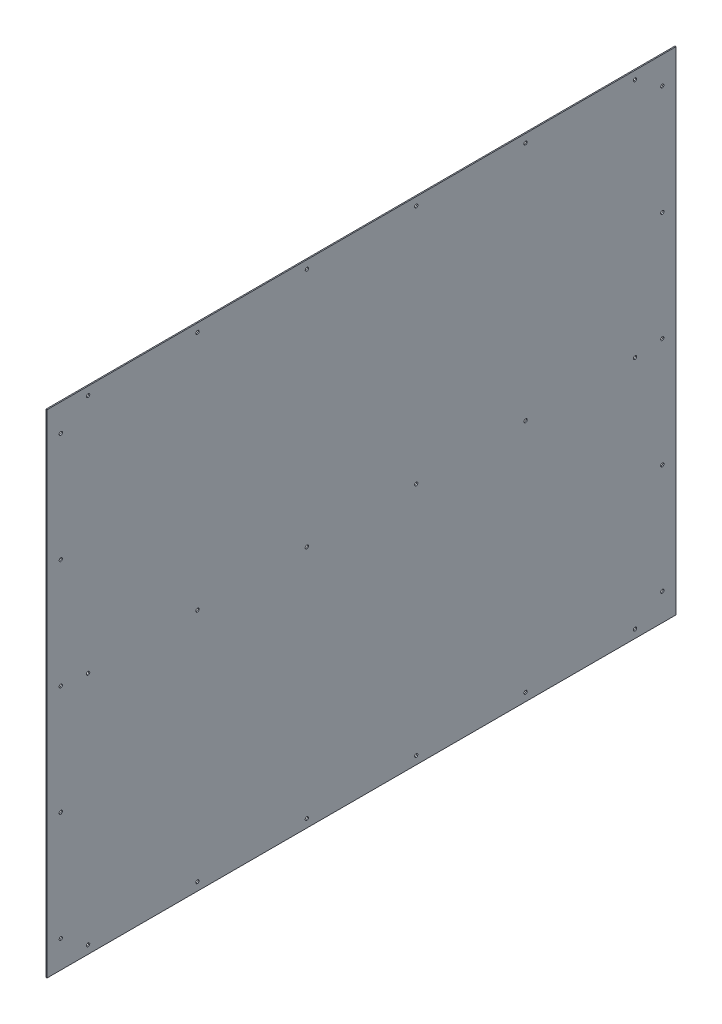
ISO-10303-21;
HEADER;
FILE_DESCRIPTION(('STEP AP214'),'2;1');
FILE_NAME('part.step','',(''),(''),'','','');
FILE_SCHEMA(('AUTOMOTIVE_DESIGN { 1 0 10303 214 1 1 1 1 }'));
ENDSEC;
DATA;
#1=APPLICATION_CONTEXT('core data for automotive mechanical design processes');
#2=APPLICATION_PROTOCOL_DEFINITION('international standard','automotive_design',2000,#1);
#3=PRODUCT_CONTEXT('',#1,'mechanical');
#4=PRODUCT('Part','Part','',(#3));
#5=PRODUCT_RELATED_PRODUCT_CATEGORY('part','',(#4));
#6=PRODUCT_DEFINITION_FORMATION('','',#4);
#7=PRODUCT_DEFINITION_CONTEXT('part definition',#1,'design');
#8=PRODUCT_DEFINITION('design','',#6,#7);
#9=PRODUCT_DEFINITION_SHAPE('','',#8);
#10=(LENGTH_UNIT() NAMED_UNIT(*) SI_UNIT(.MILLI.,.METRE.));
#11=(NAMED_UNIT(*) PLANE_ANGLE_UNIT() SI_UNIT($,.RADIAN.));
#12=(NAMED_UNIT(*) SI_UNIT($,.STERADIAN.) SOLID_ANGLE_UNIT());
#13=UNCERTAINTY_MEASURE_WITH_UNIT(LENGTH_MEASURE(1.E-05),#10,'distance_accuracy_value','');
#14=(GEOMETRIC_REPRESENTATION_CONTEXT(3) GLOBAL_UNCERTAINTY_ASSIGNED_CONTEXT((#13)) GLOBAL_UNIT_ASSIGNED_CONTEXT((#10,
#11,#12)) REPRESENTATION_CONTEXT('',''));
#15=CARTESIAN_POINT('',(0.,0.,0.));
#16=DIRECTION('',(0.,0.,1.));
#17=DIRECTION('',(1.,0.,0.));
#18=AXIS2_PLACEMENT_3D('',#15,#16,#17);
#19=CARTESIAN_POINT('',(2.,-450.,-575.));
#20=DIRECTION('',(0.,0.,1.));
#21=DIRECTION('',(1.,0.,0.));
#22=AXIS2_PLACEMENT_3D('',#19,#20,#21);
#23=PLANE('',#22);
#24=DIRECTION('',(0.,1.,0.));
#25=VECTOR('',#24,1.);
#26=CARTESIAN_POINT('',(0.,-450.,-575.));
#27=LINE('',#26,#25);
#28=CARTESIAN_POINT('',(0.,-450.,-575.));
#29=VERTEX_POINT('',#28);
#30=CARTESIAN_POINT('',(0.,450.,-575.));
#31=VERTEX_POINT('',#30);
#32=EDGE_CURVE('E110',#29,#31,#27,.T.);
#33=ORIENTED_EDGE('',*,*,#32,.T.);
#34=DIRECTION('',(-1.,0.,0.));
#35=VECTOR('',#34,1.);
#36=CARTESIAN_POINT('',(2.,450.,-575.));
#37=LINE('',#36,#35);
#38=CARTESIAN_POINT('',(2.,450.,-575.));
#39=VERTEX_POINT('',#38);
#40=EDGE_CURVE('E11',#39,#31,#37,.T.);
#41=ORIENTED_EDGE('',*,*,#40,.F.);
#42=DIRECTION('',(0.,1.,0.));
#43=VECTOR('',#42,1.);
#44=CARTESIAN_POINT('',(2.,-450.,-575.));
#45=LINE('',#44,#43);
#46=CARTESIAN_POINT('',(2.,-450.,-575.));
#47=VERTEX_POINT('',#46);
#48=EDGE_CURVE('E93',#47,#39,#45,.T.);
#49=ORIENTED_EDGE('',*,*,#48,.F.);
#50=DIRECTION('',(-1.,0.,0.));
#51=VECTOR('',#50,1.);
#52=CARTESIAN_POINT('',(2.,-450.,-575.));
#53=LINE('',#52,#51);
#54=EDGE_CURVE('E106',#47,#29,#53,.T.);
#55=ORIENTED_EDGE('',*,*,#54,.T.);
#56=EDGE_LOOP('',(#33,#41,#49,#55));
#57=FACE_BOUND('',#56,.T.);
#58=ADVANCED_FACE('F39',(#57),#23,.F.);
#59=CARTESIAN_POINT('',(2.,450.,575.));
#60=DIRECTION('',(0.,-1.,0.));
#61=DIRECTION('',(0.,0.,-1.));
#62=AXIS2_PLACEMENT_3D('',#59,#60,#61);
#63=PLANE('',#62);
#64=DIRECTION('',(0.,0.,1.));
#65=VECTOR('',#64,1.);
#66=CARTESIAN_POINT('',(0.,450.,575.));
#67=LINE('',#66,#65);
#68=CARTESIAN_POINT('',(0.,450.,575.));
#69=VERTEX_POINT('',#68);
#70=EDGE_CURVE('E98',#31,#69,#67,.T.);
#71=ORIENTED_EDGE('',*,*,#70,.T.);
#72=DIRECTION('',(-1.,0.,0.));
#73=VECTOR('',#72,1.);
#74=CARTESIAN_POINT('',(2.,450.,575.));
#75=LINE('',#74,#73);
#76=CARTESIAN_POINT('',(2.,450.,575.));
#77=VERTEX_POINT('',#76);
#78=EDGE_CURVE('E49',#77,#69,#75,.T.);
#79=ORIENTED_EDGE('',*,*,#78,.F.);
#80=DIRECTION('',(0.,0.,1.));
#81=VECTOR('',#80,1.);
#82=CARTESIAN_POINT('',(2.,450.,575.));
#83=LINE('',#82,#81);
#84=EDGE_CURVE('E88',#39,#77,#83,.T.);
#85=ORIENTED_EDGE('',*,*,#84,.F.);
#86=ORIENTED_EDGE('',*,*,#40,.T.);
#87=EDGE_LOOP('',(#71,#79,#85,#86));
#88=FACE_BOUND('',#87,.T.);
#89=ADVANCED_FACE('F97',(#88),#63,.F.);
#90=CARTESIAN_POINT('',(2.,-450.,575.));
#91=DIRECTION('',(0.,0.,-1.));
#92=DIRECTION('',(-1.,0.,0.));
#93=AXIS2_PLACEMENT_3D('',#90,#91,#92);
#94=PLANE('',#93);
#95=DIRECTION('',(0.,-1.,0.));
#96=VECTOR('',#95,1.);
#97=CARTESIAN_POINT('',(0.,-450.,575.));
#98=LINE('',#97,#96);
#99=CARTESIAN_POINT('',(0.,-450.,575.));
#100=VERTEX_POINT('',#99);
#101=EDGE_CURVE('E75',#69,#100,#98,.T.);
#102=ORIENTED_EDGE('',*,*,#101,.T.);
#103=DIRECTION('',(-1.,0.,0.));
#104=VECTOR('',#103,1.);
#105=CARTESIAN_POINT('',(2.,-450.,575.));
#106=LINE('',#105,#104);
#107=CARTESIAN_POINT('',(2.,-450.,575.));
#108=VERTEX_POINT('',#107);
#109=EDGE_CURVE('E100',#108,#100,#106,.T.);
#110=ORIENTED_EDGE('',*,*,#109,.F.);
#111=DIRECTION('',(0.,-1.,0.));
#112=VECTOR('',#111,1.);
#113=CARTESIAN_POINT('',(2.,-450.,575.));
#114=LINE('',#113,#112);
#115=EDGE_CURVE('E91',#77,#108,#114,.T.);
#116=ORIENTED_EDGE('',*,*,#115,.F.);
#117=ORIENTED_EDGE('',*,*,#78,.T.);
#118=EDGE_LOOP('',(#102,#110,#116,#117));
#119=FACE_BOUND('',#118,.T.);
#120=ADVANCED_FACE('F102',(#119),#94,.F.);
#121=CARTESIAN_POINT('',(2.,-450.,575.));
#122=DIRECTION('',(0.,1.,0.));
#123=DIRECTION('',(0.,0.,1.));
#124=AXIS2_PLACEMENT_3D('',#121,#122,#123);
#125=PLANE('',#124);
#126=DIRECTION('',(0.,0.,-1.));
#127=VECTOR('',#126,1.);
#128=CARTESIAN_POINT('',(0.,-450.,575.));
#129=LINE('',#128,#127);
#130=EDGE_CURVE('E81',#100,#29,#129,.T.);
#131=ORIENTED_EDGE('',*,*,#130,.T.);
#132=ORIENTED_EDGE('',*,*,#54,.F.);
#133=DIRECTION('',(0.,0.,-1.));
#134=VECTOR('',#133,1.);
#135=CARTESIAN_POINT('',(2.,-450.,575.));
#136=LINE('',#135,#134);
#137=EDGE_CURVE('E58',#108,#47,#136,.T.);
#138=ORIENTED_EDGE('',*,*,#137,.F.);
#139=ORIENTED_EDGE('',*,*,#109,.T.);
#140=EDGE_LOOP('',(#131,#132,#138,#139));
#141=FACE_BOUND('',#140,.T.);
#142=ADVANCED_FACE('F319',(#141),#125,.F.);
#143=CARTESIAN_POINT('',(2.,0.,0.));
#144=DIRECTION('',(-1.,0.,0.));
#145=DIRECTION('',(0.,0.,1.));
#146=AXIS2_PLACEMENT_3D('',#143,#144,#145);
#147=PLANE('',#146);
#148=CARTESIAN_POINT('',(2.,400.,-550.));
#149=DIRECTION('',(1.,0.,0.));
#150=DIRECTION('',(0.,0.,1.));
#151=AXIS2_PLACEMENT_3D('',#148,#149,#150);
#152=CIRCLE('',#151,3.00000000000005);
#153=CARTESIAN_POINT('',(2.,400.,-547.));
#154=VERTEX_POINT('',#153);
#155=EDGE_CURVE('E641',#154,#154,#152,.T.);
#156=ORIENTED_EDGE('',*,*,#155,.F.);
#157=EDGE_LOOP('',(#156));
#158=FACE_BOUND('',#157,.T.);
#159=CARTESIAN_POINT('',(2.,200.,-550.));
#160=DIRECTION('',(1.,0.,0.));
#161=DIRECTION('',(0.,0.,1.));
#162=AXIS2_PLACEMENT_3D('',#159,#160,#161);
#163=CIRCLE('',#162,3.00000000000005);
#164=CARTESIAN_POINT('',(2.,200.,-547.));
#165=VERTEX_POINT('',#164);
#166=EDGE_CURVE('E643',#165,#165,#163,.T.);
#167=ORIENTED_EDGE('',*,*,#166,.F.);
#168=EDGE_LOOP('',(#167));
#169=FACE_BOUND('',#168,.T.);
#170=CARTESIAN_POINT('',(2.,1.34711147906209E-13,-550.));
#171=DIRECTION('',(1.,0.,0.));
#172=DIRECTION('',(0.,0.,1.));
#173=AXIS2_PLACEMENT_3D('',#170,#171,#172);
#174=CIRCLE('',#173,3.00000000000005);
#175=CARTESIAN_POINT('',(2.,1.34711147906209E-13,-547.));
#176=VERTEX_POINT('',#175);
#177=EDGE_CURVE('E647',#176,#176,#174,.T.);
#178=ORIENTED_EDGE('',*,*,#177,.F.);
#179=EDGE_LOOP('',(#178));
#180=FACE_BOUND('',#179,.T.);
#181=CARTESIAN_POINT('',(2.,-200.,-550.));
#182=DIRECTION('',(1.,0.,0.));
#183=DIRECTION('',(0.,0.,1.));
#184=AXIS2_PLACEMENT_3D('',#181,#182,#183);
#185=CIRCLE('',#184,3.00000000000005);
#186=CARTESIAN_POINT('',(2.,-200.,-547.));
#187=VERTEX_POINT('',#186);
#188=EDGE_CURVE('E677',#187,#187,#185,.T.);
#189=ORIENTED_EDGE('',*,*,#188,.F.);
#190=EDGE_LOOP('',(#189));
#191=FACE_BOUND('',#190,.T.);
#192=CARTESIAN_POINT('',(2.,-400.,-550.));
#193=DIRECTION('',(1.,0.,0.));
#194=DIRECTION('',(0.,0.,1.));
#195=AXIS2_PLACEMENT_3D('',#192,#193,#194);
#196=CIRCLE('',#195,3.00000000000005);
#197=CARTESIAN_POINT('',(2.,-400.,-547.));
#198=VERTEX_POINT('',#197);
#199=EDGE_CURVE('E673',#198,#198,#196,.T.);
#200=ORIENTED_EDGE('',*,*,#199,.F.);
#201=EDGE_LOOP('',(#200));
#202=FACE_BOUND('',#201,.T.);
#203=CARTESIAN_POINT('',(2.,-400.,550.));
#204=DIRECTION('',(1.,0.,0.));
#205=DIRECTION('',(0.,0.,-1.));
#206=AXIS2_PLACEMENT_3D('',#203,#204,#205);
#207=CIRCLE('',#206,3.00000000000005);
#208=CARTESIAN_POINT('',(2.,-400.,547.));
#209=VERTEX_POINT('',#208);
#210=EDGE_CURVE('E669',#209,#209,#207,.T.);
#211=ORIENTED_EDGE('',*,*,#210,.F.);
#212=EDGE_LOOP('',(#211));
#213=FACE_BOUND('',#212,.T.);
#214=CARTESIAN_POINT('',(2.,-200.,550.));
#215=DIRECTION('',(1.,0.,0.));
#216=DIRECTION('',(0.,0.,-1.));
#217=AXIS2_PLACEMENT_3D('',#214,#215,#216);
#218=CIRCLE('',#217,3.00000000000005);
#219=CARTESIAN_POINT('',(2.,-200.,547.));
#220=VERTEX_POINT('',#219);
#221=EDGE_CURVE('E663',#220,#220,#218,.T.);
#222=ORIENTED_EDGE('',*,*,#221,.F.);
#223=EDGE_LOOP('',(#222));
#224=FACE_BOUND('',#223,.T.);
#225=CARTESIAN_POINT('',(2.,0.,550.));
#226=DIRECTION('',(1.,0.,0.));
#227=DIRECTION('',(0.,0.,-1.));
#228=AXIS2_PLACEMENT_3D('',#225,#226,#227);
#229=CIRCLE('',#228,3.00000000000005);
#230=CARTESIAN_POINT('',(2.,0.,547.));
#231=VERTEX_POINT('',#230);
#232=EDGE_CURVE('E657',#231,#231,#229,.T.);
#233=ORIENTED_EDGE('',*,*,#232,.F.);
#234=EDGE_LOOP('',(#233));
#235=FACE_BOUND('',#234,.T.);
#236=CARTESIAN_POINT('',(2.,200.,550.));
#237=DIRECTION('',(1.,0.,0.));
#238=DIRECTION('',(0.,0.,-1.));
#239=AXIS2_PLACEMENT_3D('',#236,#237,#238);
#240=CIRCLE('',#239,3.00000000000005);
#241=CARTESIAN_POINT('',(2.,200.,547.));
#242=VERTEX_POINT('',#241);
#243=EDGE_CURVE('E652',#242,#242,#240,.T.);
#244=ORIENTED_EDGE('',*,*,#243,.F.);
#245=EDGE_LOOP('',(#244));
#246=FACE_BOUND('',#245,.T.);
#247=CARTESIAN_POINT('',(2.,400.,550.));
#248=DIRECTION('',(1.,0.,0.));
#249=DIRECTION('',(0.,0.,-1.));
#250=AXIS2_PLACEMENT_3D('',#247,#248,#249);
#251=CIRCLE('',#250,3.00000000000005);
#252=CARTESIAN_POINT('',(2.,400.,547.));
#253=VERTEX_POINT('',#252);
#254=EDGE_CURVE('E130',#253,#253,#251,.T.);
#255=ORIENTED_EDGE('',*,*,#254,.F.);
#256=EDGE_LOOP('',(#255));
#257=FACE_BOUND('',#256,.T.);
#258=CARTESIAN_POINT('',(2.,-5.00000000000023,-500.));
#259=DIRECTION('',(1.,0.,0.));
#260=DIRECTION('',(0.,0.,-1.));
#261=AXIS2_PLACEMENT_3D('',#258,#259,#260);
#262=CIRCLE('',#261,3.00000000000005);
#263=CARTESIAN_POINT('',(2.,-5.00000000000023,-503.));
#264=VERTEX_POINT('',#263);
#265=EDGE_CURVE('E183',#264,#264,#262,.T.);
#266=ORIENTED_EDGE('',*,*,#265,.F.);
#267=EDGE_LOOP('',(#266));
#268=FACE_BOUND('',#267,.T.);
#269=CARTESIAN_POINT('',(2.,-435.,500.));
#270=DIRECTION('',(1.,0.,0.));
#271=DIRECTION('',(0.,0.,1.));
#272=AXIS2_PLACEMENT_3D('',#269,#270,#271);
#273=CIRCLE('',#272,2.99999999999999);
#274=CARTESIAN_POINT('',(2.,-435.,503.));
#275=VERTEX_POINT('',#274);
#276=EDGE_CURVE('E216',#275,#275,#273,.T.);
#277=ORIENTED_EDGE('',*,*,#276,.F.);
#278=EDGE_LOOP('',(#277));
#279=FACE_BOUND('',#278,.T.);
#280=CARTESIAN_POINT('',(2.,-435.,300.));
#281=DIRECTION('',(1.,0.,0.));
#282=DIRECTION('',(0.,0.,1.));
#283=AXIS2_PLACEMENT_3D('',#280,#281,#282);
#284=CIRCLE('',#283,2.99999999999999);
#285=CARTESIAN_POINT('',(2.,-435.,303.));
#286=VERTEX_POINT('',#285);
#287=EDGE_CURVE('E215',#286,#286,#284,.T.);
#288=ORIENTED_EDGE('',*,*,#287,.F.);
#289=EDGE_LOOP('',(#288));
#290=FACE_BOUND('',#289,.T.);
#291=CARTESIAN_POINT('',(2.,-435.,100.));
#292=DIRECTION('',(1.,0.,0.));
#293=DIRECTION('',(0.,0.,1.));
#294=AXIS2_PLACEMENT_3D('',#291,#292,#293);
#295=CIRCLE('',#294,2.99999999999999);
#296=CARTESIAN_POINT('',(2.,-435.,103.));
#297=VERTEX_POINT('',#296);
#298=EDGE_CURVE('E232',#297,#297,#295,.T.);
#299=ORIENTED_EDGE('',*,*,#298,.F.);
#300=EDGE_LOOP('',(#299));
#301=FACE_BOUND('',#300,.T.);
#302=CARTESIAN_POINT('',(2.,-5.00000000000023,-99.9999999999998));
#303=DIRECTION('',(1.,0.,0.));
#304=DIRECTION('',(0.,0.,-1.));
#305=AXIS2_PLACEMENT_3D('',#302,#303,#304);
#306=CIRCLE('',#305,2.99999999999999);
#307=CARTESIAN_POINT('',(2.,-5.00000000000023,-103.));
#308=VERTEX_POINT('',#307);
#309=EDGE_CURVE('E184',#308,#308,#306,.T.);
#310=ORIENTED_EDGE('',*,*,#309,.F.);
#311=EDGE_LOOP('',(#310));
#312=FACE_BOUND('',#311,.T.);
#313=CARTESIAN_POINT('',(2.,-5.00000000000023,-300.));
#314=DIRECTION('',(1.,0.,0.));
#315=DIRECTION('',(0.,0.,-1.));
#316=AXIS2_PLACEMENT_3D('',#313,#314,#315);
#317=CIRCLE('',#316,2.99999999999999);
#318=CARTESIAN_POINT('',(2.,-5.00000000000023,-303.));
#319=VERTEX_POINT('',#318);
#320=EDGE_CURVE('E192',#319,#319,#317,.T.);
#321=ORIENTED_EDGE('',*,*,#320,.F.);
#322=EDGE_LOOP('',(#321));
#323=FACE_BOUND('',#322,.T.);
#324=CARTESIAN_POINT('',(2.,-5.00000000000023,100.));
#325=DIRECTION('',(1.,0.,0.));
#326=DIRECTION('',(0.,0.,-1.));
#327=AXIS2_PLACEMENT_3D('',#324,#325,#326);
#328=CIRCLE('',#327,2.99999999999999);
#329=CARTESIAN_POINT('',(2.,-5.00000000000023,97.0000000000003));
#330=VERTEX_POINT('',#329);
#331=EDGE_CURVE('E200',#330,#330,#328,.T.);
#332=ORIENTED_EDGE('',*,*,#331,.F.);
#333=EDGE_LOOP('',(#332));
#334=FACE_BOUND('',#333,.T.);
#335=CARTESIAN_POINT('',(2.,-5.00000000000023,300.));
#336=DIRECTION('',(1.,0.,0.));
#337=DIRECTION('',(0.,0.,-1.));
#338=AXIS2_PLACEMENT_3D('',#335,#336,#337);
#339=CIRCLE('',#338,2.99999999999999);
#340=CARTESIAN_POINT('',(2.,-5.00000000000023,297.));
#341=VERTEX_POINT('',#340);
#342=EDGE_CURVE('E175',#341,#341,#339,.T.);
#343=ORIENTED_EDGE('',*,*,#342,.F.);
#344=EDGE_LOOP('',(#343));
#345=FACE_BOUND('',#344,.T.);
#346=CARTESIAN_POINT('',(2.,435.,300.));
#347=DIRECTION('',(1.,0.,0.));
#348=DIRECTION('',(0.,0.,-1.));
#349=AXIS2_PLACEMENT_3D('',#346,#347,#348);
#350=CIRCLE('',#349,2.99999999999999);
#351=CARTESIAN_POINT('',(2.,435.,297.));
#352=VERTEX_POINT('',#351);
#353=EDGE_CURVE('E280',#352,#352,#350,.T.);
#354=ORIENTED_EDGE('',*,*,#353,.F.);
#355=EDGE_LOOP('',(#354));
#356=FACE_BOUND('',#355,.T.);
#357=CARTESIAN_POINT('',(2.,435.,100.));
#358=DIRECTION('',(1.,0.,0.));
#359=DIRECTION('',(0.,0.,-1.));
#360=AXIS2_PLACEMENT_3D('',#357,#358,#359);
#361=CIRCLE('',#360,2.99999999999999);
#362=CARTESIAN_POINT('',(2.,435.,97.0000000000003));
#363=VERTEX_POINT('',#362);
#364=EDGE_CURVE('E288',#363,#363,#361,.T.);
#365=ORIENTED_EDGE('',*,*,#364,.F.);
#366=EDGE_LOOP('',(#365));
#367=FACE_BOUND('',#366,.T.);
#368=CARTESIAN_POINT('',(2.,435.,-99.9999999999998));
#369=DIRECTION('',(1.,0.,0.));
#370=DIRECTION('',(0.,0.,-1.));
#371=AXIS2_PLACEMENT_3D('',#368,#369,#370);
#372=CIRCLE('',#371,2.99999999999999);
#373=CARTESIAN_POINT('',(2.,435.,-103.));
#374=VERTEX_POINT('',#373);
#375=EDGE_CURVE('E296',#374,#374,#372,.T.);
#376=ORIENTED_EDGE('',*,*,#375,.F.);
#377=EDGE_LOOP('',(#376));
#378=FACE_BOUND('',#377,.T.);
#379=CARTESIAN_POINT('',(2.,435.,-300.));
#380=DIRECTION('',(1.,0.,0.));
#381=DIRECTION('',(0.,0.,-1.));
#382=AXIS2_PLACEMENT_3D('',#379,#380,#381);
#383=CIRCLE('',#382,2.99999999999999);
#384=CARTESIAN_POINT('',(2.,435.,-303.));
#385=VERTEX_POINT('',#384);
#386=EDGE_CURVE('E247',#385,#385,#383,.T.);
#387=ORIENTED_EDGE('',*,*,#386,.F.);
#388=EDGE_LOOP('',(#387));
#389=FACE_BOUND('',#388,.T.);
#390=CARTESIAN_POINT('',(2.,435.,-500.));
#391=DIRECTION('',(1.,0.,0.));
#392=DIRECTION('',(0.,0.,-1.));
#393=AXIS2_PLACEMENT_3D('',#390,#391,#392);
#394=CIRCLE('',#393,3.00000000000005);
#395=CARTESIAN_POINT('',(2.,435.,-503.));
#396=VERTEX_POINT('',#395);
#397=EDGE_CURVE('E248',#396,#396,#394,.T.);
#398=ORIENTED_EDGE('',*,*,#397,.F.);
#399=EDGE_LOOP('',(#398));
#400=FACE_BOUND('',#399,.T.);
#401=CARTESIAN_POINT('',(2.,-435.,-500.));
#402=DIRECTION('',(1.,0.,0.));
#403=DIRECTION('',(0.,0.,1.));
#404=AXIS2_PLACEMENT_3D('',#401,#402,#403);
#405=CIRCLE('',#404,3.00000000000005);
#406=CARTESIAN_POINT('',(2.,-435.,-497.));
#407=VERTEX_POINT('',#406);
#408=EDGE_CURVE('E256',#407,#407,#405,.T.);
#409=ORIENTED_EDGE('',*,*,#408,.F.);
#410=EDGE_LOOP('',(#409));
#411=FACE_BOUND('',#410,.T.);
#412=CARTESIAN_POINT('',(2.,-435.,-300.));
#413=DIRECTION('',(1.,0.,0.));
#414=DIRECTION('',(0.,0.,1.));
#415=AXIS2_PLACEMENT_3D('',#412,#413,#414);
#416=CIRCLE('',#415,2.99999999999999);
#417=CARTESIAN_POINT('',(2.,-435.,-297.));
#418=VERTEX_POINT('',#417);
#419=EDGE_CURVE('E264',#418,#418,#416,.T.);
#420=ORIENTED_EDGE('',*,*,#419,.F.);
#421=EDGE_LOOP('',(#420));
#422=FACE_BOUND('',#421,.T.);
#423=CARTESIAN_POINT('',(2.,-435.,-99.9999999999998));
#424=DIRECTION('',(1.,0.,0.));
#425=DIRECTION('',(0.,0.,1.));
#426=AXIS2_PLACEMENT_3D('',#423,#424,#425);
#427=CIRCLE('',#426,2.99999999999999);
#428=CARTESIAN_POINT('',(2.,-435.,-96.9999999999998));
#429=VERTEX_POINT('',#428);
#430=EDGE_CURVE('E231',#429,#429,#427,.T.);
#431=ORIENTED_EDGE('',*,*,#430,.F.);
#432=EDGE_LOOP('',(#431));
#433=FACE_BOUND('',#432,.T.);
#434=CARTESIAN_POINT('',(2.,-5.00000000000023,500.));
#435=DIRECTION('',(1.,0.,0.));
#436=DIRECTION('',(0.,0.,-1.));
#437=AXIS2_PLACEMENT_3D('',#434,#435,#436);
#438=CIRCLE('',#437,2.99999999999999);
#439=CARTESIAN_POINT('',(2.,-5.00000000000023,497.));
#440=VERTEX_POINT('',#439);
#441=EDGE_CURVE('E164',#440,#440,#438,.T.);
#442=ORIENTED_EDGE('',*,*,#441,.F.);
#443=EDGE_LOOP('',(#442));
#444=FACE_BOUND('',#443,.T.);
#445=CARTESIAN_POINT('',(2.,435.,500.));
#446=DIRECTION('',(1.,0.,0.));
#447=DIRECTION('',(0.,0.,-1.));
#448=AXIS2_PLACEMENT_3D('',#445,#446,#447);
#449=CIRCLE('',#448,2.99999999999999);
#450=CARTESIAN_POINT('',(2.,435.,497.));
#451=VERTEX_POINT('',#450);
#452=EDGE_CURVE('E279',#451,#451,#449,.T.);
#453=ORIENTED_EDGE('',*,*,#452,.F.);
#454=EDGE_LOOP('',(#453));
#455=FACE_BOUND('',#454,.T.);
#456=ORIENTED_EDGE('',*,*,#48,.T.);
#457=ORIENTED_EDGE('',*,*,#84,.T.);
#458=ORIENTED_EDGE('',*,*,#115,.T.);
#459=ORIENTED_EDGE('',*,*,#137,.T.);
#460=EDGE_LOOP('',(#456,#457,#458,#459));
#461=FACE_BOUND('',#460,.T.);
#462=ADVANCED_FACE('F89',(#158,#169,#180,#191,#202,#213,#224,#235,#246,#257,#268,#279,#290,#301,
#312,#323,#334,#345,#356,#367,#378,#389,#400,#411,#422,#433,#444,#455,#461),#147,.F.);
#463=CARTESIAN_POINT('',(0.,0.,0.));
#464=DIRECTION('',(-1.,0.,0.));
#465=DIRECTION('',(0.,0.,1.));
#466=AXIS2_PLACEMENT_3D('',#463,#464,#465);
#467=PLANE('',#466);
#468=CARTESIAN_POINT('',(0.,400.,-550.));
#469=DIRECTION('',(-1.,0.,0.));
#470=DIRECTION('',(0.,0.,1.));
#471=AXIS2_PLACEMENT_3D('',#468,#469,#470);
#472=CIRCLE('',#471,3.00000000000005);
#473=CARTESIAN_POINT('',(0.,400.,-547.));
#474=VERTEX_POINT('',#473);
#475=EDGE_CURVE('E42',#474,#474,#472,.T.);
#476=ORIENTED_EDGE('',*,*,#475,.F.);
#477=EDGE_LOOP('',(#476));
#478=FACE_BOUND('',#477,.T.);
#479=CARTESIAN_POINT('',(0.,200.,-550.));
#480=DIRECTION('',(-1.,0.,0.));
#481=DIRECTION('',(0.,0.,1.));
#482=AXIS2_PLACEMENT_3D('',#479,#480,#481);
#483=CIRCLE('',#482,3.00000000000005);
#484=CARTESIAN_POINT('',(0.,200.,-547.));
#485=VERTEX_POINT('',#484);
#486=EDGE_CURVE('E157',#485,#485,#483,.T.);
#487=ORIENTED_EDGE('',*,*,#486,.F.);
#488=EDGE_LOOP('',(#487));
#489=FACE_BOUND('',#488,.T.);
#490=CARTESIAN_POINT('',(0.,1.34711147906209E-13,-550.));
#491=DIRECTION('',(-1.,0.,0.));
#492=DIRECTION('',(0.,0.,1.));
#493=AXIS2_PLACEMENT_3D('',#490,#491,#492);
#494=CIRCLE('',#493,3.00000000000005);
#495=CARTESIAN_POINT('',(0.,1.34711147906209E-13,-547.));
#496=VERTEX_POINT('',#495);
#497=EDGE_CURVE('E154',#496,#496,#494,.T.);
#498=ORIENTED_EDGE('',*,*,#497,.F.);
#499=EDGE_LOOP('',(#498));
#500=FACE_BOUND('',#499,.T.);
#501=CARTESIAN_POINT('',(0.,-200.,-550.));
#502=DIRECTION('',(-1.,0.,0.));
#503=DIRECTION('',(0.,0.,1.));
#504=AXIS2_PLACEMENT_3D('',#501,#502,#503);
#505=CIRCLE('',#504,3.00000000000005);
#506=CARTESIAN_POINT('',(0.,-200.,-547.));
#507=VERTEX_POINT('',#506);
#508=EDGE_CURVE('E150',#507,#507,#505,.T.);
#509=ORIENTED_EDGE('',*,*,#508,.F.);
#510=EDGE_LOOP('',(#509));
#511=FACE_BOUND('',#510,.T.);
#512=CARTESIAN_POINT('',(0.,-400.,-550.));
#513=DIRECTION('',(-1.,0.,0.));
#514=DIRECTION('',(0.,0.,1.));
#515=AXIS2_PLACEMENT_3D('',#512,#513,#514);
#516=CIRCLE('',#515,3.00000000000005);
#517=CARTESIAN_POINT('',(0.,-400.,-547.));
#518=VERTEX_POINT('',#517);
#519=EDGE_CURVE('E146',#518,#518,#516,.T.);
#520=ORIENTED_EDGE('',*,*,#519,.F.);
#521=EDGE_LOOP('',(#520));
#522=FACE_BOUND('',#521,.T.);
#523=CARTESIAN_POINT('',(0.,-400.,550.));
#524=DIRECTION('',(-1.,0.,0.));
#525=DIRECTION('',(0.,0.,1.));
#526=AXIS2_PLACEMENT_3D('',#523,#524,#525);
#527=CIRCLE('',#526,3.00000000000005);
#528=CARTESIAN_POINT('',(0.,-400.,553.));
#529=VERTEX_POINT('',#528);
#530=EDGE_CURVE('E142',#529,#529,#527,.T.);
#531=ORIENTED_EDGE('',*,*,#530,.F.);
#532=EDGE_LOOP('',(#531));
#533=FACE_BOUND('',#532,.T.);
#534=CARTESIAN_POINT('',(0.,-200.,550.));
#535=DIRECTION('',(-1.,0.,0.));
#536=DIRECTION('',(0.,0.,1.));
#537=AXIS2_PLACEMENT_3D('',#534,#535,#536);
#538=CIRCLE('',#537,3.00000000000005);
#539=CARTESIAN_POINT('',(0.,-200.,553.));
#540=VERTEX_POINT('',#539);
#541=EDGE_CURVE('E138',#540,#540,#538,.T.);
#542=ORIENTED_EDGE('',*,*,#541,.F.);
#543=EDGE_LOOP('',(#542));
#544=FACE_BOUND('',#543,.T.);
#545=CARTESIAN_POINT('',(0.,0.,550.));
#546=DIRECTION('',(-1.,0.,0.));
#547=DIRECTION('',(0.,0.,1.));
#548=AXIS2_PLACEMENT_3D('',#545,#546,#547);
#549=CIRCLE('',#548,3.00000000000005);
#550=CARTESIAN_POINT('',(0.,0.,553.));
#551=VERTEX_POINT('',#550);
#552=EDGE_CURVE('E134',#551,#551,#549,.T.);
#553=ORIENTED_EDGE('',*,*,#552,.F.);
#554=EDGE_LOOP('',(#553));
#555=FACE_BOUND('',#554,.T.);
#556=CARTESIAN_POINT('',(0.,200.,550.));
#557=DIRECTION('',(-1.,0.,0.));
#558=DIRECTION('',(0.,0.,1.));
#559=AXIS2_PLACEMENT_3D('',#556,#557,#558);
#560=CIRCLE('',#559,3.00000000000005);
#561=CARTESIAN_POINT('',(0.,200.,553.));
#562=VERTEX_POINT('',#561);
#563=EDGE_CURVE('E129',#562,#562,#560,.T.);
#564=ORIENTED_EDGE('',*,*,#563,.F.);
#565=EDGE_LOOP('',(#564));
#566=FACE_BOUND('',#565,.T.);
#567=CARTESIAN_POINT('',(0.,400.,550.));
#568=DIRECTION('',(-1.,0.,0.));
#569=DIRECTION('',(0.,0.,1.));
#570=AXIS2_PLACEMENT_3D('',#567,#568,#569);
#571=CIRCLE('',#570,3.00000000000005);
#572=CARTESIAN_POINT('',(0.,400.,553.));
#573=VERTEX_POINT('',#572);
#574=EDGE_CURVE('E125',#573,#573,#571,.T.);
#575=ORIENTED_EDGE('',*,*,#574,.F.);
#576=EDGE_LOOP('',(#575));
#577=FACE_BOUND('',#576,.T.);
#578=CARTESIAN_POINT('',(0.,-5.00000000000023,-500.));
#579=DIRECTION('',(1.,0.,0.));
#580=DIRECTION('',(0.,0.,-1.));
#581=AXIS2_PLACEMENT_3D('',#578,#579,#580);
#582=CIRCLE('',#581,3.00000000000005);
#583=CARTESIAN_POINT('',(0.,-5.00000000000023,-503.));
#584=VERTEX_POINT('',#583);
#585=EDGE_CURVE('E220',#584,#584,#582,.T.);
#586=ORIENTED_EDGE('',*,*,#585,.T.);
#587=EDGE_LOOP('',(#586));
#588=FACE_BOUND('',#587,.T.);
#589=CARTESIAN_POINT('',(0.,-435.,500.));
#590=DIRECTION('',(1.,0.,0.));
#591=DIRECTION('',(0.,0.,1.));
#592=AXIS2_PLACEMENT_3D('',#589,#590,#591);
#593=CIRCLE('',#592,2.99999999999999);
#594=CARTESIAN_POINT('',(0.,-435.,503.));
#595=VERTEX_POINT('',#594);
#596=EDGE_CURVE('E211',#595,#595,#593,.T.);
#597=ORIENTED_EDGE('',*,*,#596,.T.);
#598=EDGE_LOOP('',(#597));
#599=FACE_BOUND('',#598,.T.);
#600=CARTESIAN_POINT('',(0.,-435.,300.));
#601=DIRECTION('',(1.,0.,0.));
#602=DIRECTION('',(0.,0.,1.));
#603=AXIS2_PLACEMENT_3D('',#600,#601,#602);
#604=CIRCLE('',#603,2.99999999999999);
#605=CARTESIAN_POINT('',(0.,-435.,303.));
#606=VERTEX_POINT('',#605);
#607=EDGE_CURVE('E236',#606,#606,#604,.T.);
#608=ORIENTED_EDGE('',*,*,#607,.T.);
#609=EDGE_LOOP('',(#608));
#610=FACE_BOUND('',#609,.T.);
#611=CARTESIAN_POINT('',(0.,-435.,100.));
#612=DIRECTION('',(1.,0.,0.));
#613=DIRECTION('',(0.,0.,1.));
#614=AXIS2_PLACEMENT_3D('',#611,#612,#613);
#615=CIRCLE('',#614,2.99999999999999);
#616=CARTESIAN_POINT('',(0.,-435.,103.));
#617=VERTEX_POINT('',#616);
#618=EDGE_CURVE('E227',#617,#617,#615,.T.);
#619=ORIENTED_EDGE('',*,*,#618,.T.);
#620=EDGE_LOOP('',(#619));
#621=FACE_BOUND('',#620,.T.);
#622=CARTESIAN_POINT('',(0.,-5.00000000000023,-99.9999999999998));
#623=DIRECTION('',(1.,0.,0.));
#624=DIRECTION('',(0.,0.,-1.));
#625=AXIS2_PLACEMENT_3D('',#622,#623,#624);
#626=CIRCLE('',#625,2.99999999999999);
#627=CARTESIAN_POINT('',(0.,-5.00000000000023,-103.));
#628=VERTEX_POINT('',#627);
#629=EDGE_CURVE('E179',#628,#628,#626,.T.);
#630=ORIENTED_EDGE('',*,*,#629,.T.);
#631=EDGE_LOOP('',(#630));
#632=FACE_BOUND('',#631,.T.);
#633=CARTESIAN_POINT('',(0.,-5.00000000000023,-300.));
#634=DIRECTION('',(1.,0.,0.));
#635=DIRECTION('',(0.,0.,-1.));
#636=AXIS2_PLACEMENT_3D('',#633,#634,#635);
#637=CIRCLE('',#636,2.99999999999999);
#638=CARTESIAN_POINT('',(0.,-5.00000000000023,-303.));
#639=VERTEX_POINT('',#638);
#640=EDGE_CURVE('E188',#639,#639,#637,.T.);
#641=ORIENTED_EDGE('',*,*,#640,.T.);
#642=EDGE_LOOP('',(#641));
#643=FACE_BOUND('',#642,.T.);
#644=CARTESIAN_POINT('',(0.,-5.00000000000023,100.));
#645=DIRECTION('',(1.,0.,0.));
#646=DIRECTION('',(0.,0.,-1.));
#647=AXIS2_PLACEMENT_3D('',#644,#645,#646);
#648=CIRCLE('',#647,2.99999999999999);
#649=CARTESIAN_POINT('',(0.,-5.00000000000023,97.0000000000003));
#650=VERTEX_POINT('',#649);
#651=EDGE_CURVE('E196',#650,#650,#648,.T.);
#652=ORIENTED_EDGE('',*,*,#651,.T.);
#653=EDGE_LOOP('',(#652));
#654=FACE_BOUND('',#653,.T.);
#655=CARTESIAN_POINT('',(0.,-5.00000000000023,300.));
#656=DIRECTION('',(1.,0.,0.));
#657=DIRECTION('',(0.,0.,-1.));
#658=AXIS2_PLACEMENT_3D('',#655,#656,#657);
#659=CIRCLE('',#658,2.99999999999999);
#660=CARTESIAN_POINT('',(0.,-5.00000000000023,297.));
#661=VERTEX_POINT('',#660);
#662=EDGE_CURVE('E204',#661,#661,#659,.T.);
#663=ORIENTED_EDGE('',*,*,#662,.T.);
#664=EDGE_LOOP('',(#663));
#665=FACE_BOUND('',#664,.T.);
#666=CARTESIAN_POINT('',(0.,435.,300.));
#667=DIRECTION('',(1.,0.,0.));
#668=DIRECTION('',(0.,0.,-1.));
#669=AXIS2_PLACEMENT_3D('',#666,#667,#668);
#670=CIRCLE('',#669,2.99999999999999);
#671=CARTESIAN_POINT('',(0.,435.,297.));
#672=VERTEX_POINT('',#671);
#673=EDGE_CURVE('E275',#672,#672,#670,.T.);
#674=ORIENTED_EDGE('',*,*,#673,.T.);
#675=EDGE_LOOP('',(#674));
#676=FACE_BOUND('',#675,.T.);
#677=CARTESIAN_POINT('',(0.,435.,100.));
#678=DIRECTION('',(1.,0.,0.));
#679=DIRECTION('',(0.,0.,-1.));
#680=AXIS2_PLACEMENT_3D('',#677,#678,#679);
#681=CIRCLE('',#680,2.99999999999999);
#682=CARTESIAN_POINT('',(0.,435.,97.0000000000003));
#683=VERTEX_POINT('',#682);
#684=EDGE_CURVE('E284',#683,#683,#681,.T.);
#685=ORIENTED_EDGE('',*,*,#684,.T.);
#686=EDGE_LOOP('',(#685));
#687=FACE_BOUND('',#686,.T.);
#688=CARTESIAN_POINT('',(0.,435.,-99.9999999999998));
#689=DIRECTION('',(1.,0.,0.));
#690=DIRECTION('',(0.,0.,-1.));
#691=AXIS2_PLACEMENT_3D('',#688,#689,#690);
#692=CIRCLE('',#691,2.99999999999999);
#693=CARTESIAN_POINT('',(0.,435.,-103.));
#694=VERTEX_POINT('',#693);
#695=EDGE_CURVE('E292',#694,#694,#692,.T.);
#696=ORIENTED_EDGE('',*,*,#695,.T.);
#697=EDGE_LOOP('',(#696));
#698=FACE_BOUND('',#697,.T.);
#699=CARTESIAN_POINT('',(0.,435.,-300.));
#700=DIRECTION('',(1.,0.,0.));
#701=DIRECTION('',(0.,0.,-1.));
#702=AXIS2_PLACEMENT_3D('',#699,#700,#701);
#703=CIRCLE('',#702,2.99999999999999);
#704=CARTESIAN_POINT('',(0.,435.,-303.));
#705=VERTEX_POINT('',#704);
#706=EDGE_CURVE('E300',#705,#705,#703,.T.);
#707=ORIENTED_EDGE('',*,*,#706,.T.);
#708=EDGE_LOOP('',(#707));
#709=FACE_BOUND('',#708,.T.);
#710=CARTESIAN_POINT('',(0.,435.,-500.));
#711=DIRECTION('',(1.,0.,0.));
#712=DIRECTION('',(0.,0.,-1.));
#713=AXIS2_PLACEMENT_3D('',#710,#711,#712);
#714=CIRCLE('',#713,3.00000000000005);
#715=CARTESIAN_POINT('',(0.,435.,-503.));
#716=VERTEX_POINT('',#715);
#717=EDGE_CURVE('E243',#716,#716,#714,.T.);
#718=ORIENTED_EDGE('',*,*,#717,.T.);
#719=EDGE_LOOP('',(#718));
#720=FACE_BOUND('',#719,.T.);
#721=CARTESIAN_POINT('',(0.,-435.,-500.));
#722=DIRECTION('',(1.,0.,0.));
#723=DIRECTION('',(0.,0.,1.));
#724=AXIS2_PLACEMENT_3D('',#721,#722,#723);
#725=CIRCLE('',#724,3.00000000000005);
#726=CARTESIAN_POINT('',(0.,-435.,-497.));
#727=VERTEX_POINT('',#726);
#728=EDGE_CURVE('E252',#727,#727,#725,.T.);
#729=ORIENTED_EDGE('',*,*,#728,.T.);
#730=EDGE_LOOP('',(#729));
#731=FACE_BOUND('',#730,.T.);
#732=CARTESIAN_POINT('',(0.,-435.,-300.));
#733=DIRECTION('',(1.,0.,0.));
#734=DIRECTION('',(0.,0.,1.));
#735=AXIS2_PLACEMENT_3D('',#732,#733,#734);
#736=CIRCLE('',#735,2.99999999999999);
#737=CARTESIAN_POINT('',(0.,-435.,-297.));
#738=VERTEX_POINT('',#737);
#739=EDGE_CURVE('E260',#738,#738,#736,.T.);
#740=ORIENTED_EDGE('',*,*,#739,.T.);
#741=EDGE_LOOP('',(#740));
#742=FACE_BOUND('',#741,.T.);
#743=CARTESIAN_POINT('',(0.,-435.,-99.9999999999998));
#744=DIRECTION('',(1.,0.,0.));
#745=DIRECTION('',(0.,0.,1.));
#746=AXIS2_PLACEMENT_3D('',#743,#744,#745);
#747=CIRCLE('',#746,2.99999999999999);
#748=CARTESIAN_POINT('',(0.,-435.,-96.9999999999998));
#749=VERTEX_POINT('',#748);
#750=EDGE_CURVE('E268',#749,#749,#747,.T.);
#751=ORIENTED_EDGE('',*,*,#750,.T.);
#752=EDGE_LOOP('',(#751));
#753=FACE_BOUND('',#752,.T.);
#754=CARTESIAN_POINT('',(0.,-5.00000000000023,500.));
#755=DIRECTION('',(1.,0.,0.));
#756=DIRECTION('',(0.,0.,-1.));
#757=AXIS2_PLACEMENT_3D('',#754,#755,#756);
#758=CIRCLE('',#757,2.99999999999999);
#759=CARTESIAN_POINT('',(0.,-5.00000000000023,497.));
#760=VERTEX_POINT('',#759);
#761=EDGE_CURVE('E169',#760,#760,#758,.T.);
#762=ORIENTED_EDGE('',*,*,#761,.T.);
#763=EDGE_LOOP('',(#762));
#764=FACE_BOUND('',#763,.T.);
#765=CARTESIAN_POINT('',(0.,435.,500.));
#766=DIRECTION('',(1.,0.,0.));
#767=DIRECTION('',(0.,0.,-1.));
#768=AXIS2_PLACEMENT_3D('',#765,#766,#767);
#769=CIRCLE('',#768,2.99999999999999);
#770=CARTESIAN_POINT('',(0.,435.,497.));
#771=VERTEX_POINT('',#770);
#772=EDGE_CURVE('E114',#771,#771,#769,.T.);
#773=ORIENTED_EDGE('',*,*,#772,.T.);
#774=EDGE_LOOP('',(#773));
#775=FACE_BOUND('',#774,.T.);
#776=ORIENTED_EDGE('',*,*,#32,.F.);
#777=ORIENTED_EDGE('',*,*,#130,.F.);
#778=ORIENTED_EDGE('',*,*,#101,.F.);
#779=ORIENTED_EDGE('',*,*,#70,.F.);
#780=EDGE_LOOP('',(#776,#777,#778,#779));
#781=FACE_BOUND('',#780,.T.);
#782=ADVANCED_FACE('F318',(#478,#489,#500,#511,#522,#533,#544,#555,#566,#577,#588,#599,#610,
#621,#632,#643,#654,#665,#676,#687,#698,#709,#720,#731,#742,#753,#764,#775,#781),#467,.T.);
#783=CARTESIAN_POINT('',(0.,435.,500.));
#784=DIRECTION('',(1.,0.,0.));
#785=DIRECTION('',(0.,0.,-1.));
#786=AXIS2_PLACEMENT_3D('',#783,#784,#785);
#787=CYLINDRICAL_SURFACE('',#786,2.99999999999999);
#788=ORIENTED_EDGE('',*,*,#772,.F.);
#789=EDGE_LOOP('',(#788));
#790=FACE_BOUND('',#789,.T.);
#791=ORIENTED_EDGE('',*,*,#452,.T.);
#792=EDGE_LOOP('',(#791));
#793=FACE_BOUND('',#792,.T.);
#794=ADVANCED_FACE('F315',(#790,#793),#787,.F.);
#795=CARTESIAN_POINT('',(0.,-5.00000000000023,500.));
#796=DIRECTION('',(1.,0.,0.));
#797=DIRECTION('',(0.,0.,-1.));
#798=AXIS2_PLACEMENT_3D('',#795,#796,#797);
#799=CYLINDRICAL_SURFACE('',#798,2.99999999999999);
#800=ORIENTED_EDGE('',*,*,#761,.F.);
#801=EDGE_LOOP('',(#800));
#802=FACE_BOUND('',#801,.T.);
#803=ORIENTED_EDGE('',*,*,#441,.T.);
#804=EDGE_LOOP('',(#803));
#805=FACE_BOUND('',#804,.T.);
#806=ADVANCED_FACE('F359',(#802,#805),#799,.F.);
#807=CARTESIAN_POINT('',(0.,-435.,-99.9999999999998));
#808=DIRECTION('',(1.,0.,0.));
#809=DIRECTION('',(0.,0.,-1.));
#810=AXIS2_PLACEMENT_3D('',#807,#808,#809);
#811=CYLINDRICAL_SURFACE('',#810,2.99999999999999);
#812=ORIENTED_EDGE('',*,*,#750,.F.);
#813=EDGE_LOOP('',(#812));
#814=FACE_BOUND('',#813,.T.);
#815=ORIENTED_EDGE('',*,*,#430,.T.);
#816=EDGE_LOOP('',(#815));
#817=FACE_BOUND('',#816,.T.);
#818=ADVANCED_FACE('F369',(#814,#817),#811,.F.);
#819=CARTESIAN_POINT('',(0.,-435.,-300.));
#820=DIRECTION('',(1.,0.,0.));
#821=DIRECTION('',(0.,0.,-1.));
#822=AXIS2_PLACEMENT_3D('',#819,#820,#821);
#823=CYLINDRICAL_SURFACE('',#822,2.99999999999999);
#824=ORIENTED_EDGE('',*,*,#739,.F.);
#825=EDGE_LOOP('',(#824));
#826=FACE_BOUND('',#825,.T.);
#827=ORIENTED_EDGE('',*,*,#419,.T.);
#828=EDGE_LOOP('',(#827));
#829=FACE_BOUND('',#828,.T.);
#830=ADVANCED_FACE('F379',(#826,#829),#823,.F.);
#831=CARTESIAN_POINT('',(0.,-435.,-500.));
#832=DIRECTION('',(1.,0.,0.));
#833=DIRECTION('',(0.,0.,-1.));
#834=AXIS2_PLACEMENT_3D('',#831,#832,#833);
#835=CYLINDRICAL_SURFACE('',#834,3.00000000000005);
#836=ORIENTED_EDGE('',*,*,#728,.F.);
#837=EDGE_LOOP('',(#836));
#838=FACE_BOUND('',#837,.T.);
#839=ORIENTED_EDGE('',*,*,#408,.T.);
#840=EDGE_LOOP('',(#839));
#841=FACE_BOUND('',#840,.T.);
#842=ADVANCED_FACE('F389',(#838,#841),#835,.F.);
#843=CARTESIAN_POINT('',(0.,435.,-500.));
#844=DIRECTION('',(1.,0.,0.));
#845=DIRECTION('',(0.,0.,-1.));
#846=AXIS2_PLACEMENT_3D('',#843,#844,#845);
#847=CYLINDRICAL_SURFACE('',#846,3.00000000000005);
#848=ORIENTED_EDGE('',*,*,#717,.F.);
#849=EDGE_LOOP('',(#848));
#850=FACE_BOUND('',#849,.T.);
#851=ORIENTED_EDGE('',*,*,#397,.T.);
#852=EDGE_LOOP('',(#851));
#853=FACE_BOUND('',#852,.T.);
#854=ADVANCED_FACE('F399',(#850,#853),#847,.F.);
#855=CARTESIAN_POINT('',(0.,435.,-300.));
#856=DIRECTION('',(1.,0.,0.));
#857=DIRECTION('',(0.,0.,-1.));
#858=AXIS2_PLACEMENT_3D('',#855,#856,#857);
#859=CYLINDRICAL_SURFACE('',#858,2.99999999999999);
#860=ORIENTED_EDGE('',*,*,#706,.F.);
#861=EDGE_LOOP('',(#860));
#862=FACE_BOUND('',#861,.T.);
#863=ORIENTED_EDGE('',*,*,#386,.T.);
#864=EDGE_LOOP('',(#863));
#865=FACE_BOUND('',#864,.T.);
#866=ADVANCED_FACE('F409',(#862,#865),#859,.F.);
#867=CARTESIAN_POINT('',(0.,435.,-99.9999999999998));
#868=DIRECTION('',(1.,0.,0.));
#869=DIRECTION('',(0.,0.,-1.));
#870=AXIS2_PLACEMENT_3D('',#867,#868,#869);
#871=CYLINDRICAL_SURFACE('',#870,2.99999999999999);
#872=ORIENTED_EDGE('',*,*,#695,.F.);
#873=EDGE_LOOP('',(#872));
#874=FACE_BOUND('',#873,.T.);
#875=ORIENTED_EDGE('',*,*,#375,.T.);
#876=EDGE_LOOP('',(#875));
#877=FACE_BOUND('',#876,.T.);
#878=ADVANCED_FACE('F419',(#874,#877),#871,.F.);
#879=CARTESIAN_POINT('',(0.,435.,100.));
#880=DIRECTION('',(1.,0.,0.));
#881=DIRECTION('',(0.,0.,-1.));
#882=AXIS2_PLACEMENT_3D('',#879,#880,#881);
#883=CYLINDRICAL_SURFACE('',#882,2.99999999999999);
#884=ORIENTED_EDGE('',*,*,#684,.F.);
#885=EDGE_LOOP('',(#884));
#886=FACE_BOUND('',#885,.T.);
#887=ORIENTED_EDGE('',*,*,#364,.T.);
#888=EDGE_LOOP('',(#887));
#889=FACE_BOUND('',#888,.T.);
#890=ADVANCED_FACE('F429',(#886,#889),#883,.F.);
#891=CARTESIAN_POINT('',(0.,435.,300.));
#892=DIRECTION('',(1.,0.,0.));
#893=DIRECTION('',(0.,0.,-1.));
#894=AXIS2_PLACEMENT_3D('',#891,#892,#893);
#895=CYLINDRICAL_SURFACE('',#894,2.99999999999999);
#896=ORIENTED_EDGE('',*,*,#673,.F.);
#897=EDGE_LOOP('',(#896));
#898=FACE_BOUND('',#897,.T.);
#899=ORIENTED_EDGE('',*,*,#353,.T.);
#900=EDGE_LOOP('',(#899));
#901=FACE_BOUND('',#900,.T.);
#902=ADVANCED_FACE('F439',(#898,#901),#895,.F.);
#903=CARTESIAN_POINT('',(0.,-5.00000000000023,300.));
#904=DIRECTION('',(1.,0.,0.));
#905=DIRECTION('',(0.,0.,-1.));
#906=AXIS2_PLACEMENT_3D('',#903,#904,#905);
#907=CYLINDRICAL_SURFACE('',#906,2.99999999999999);
#908=ORIENTED_EDGE('',*,*,#662,.F.);
#909=EDGE_LOOP('',(#908));
#910=FACE_BOUND('',#909,.T.);
#911=ORIENTED_EDGE('',*,*,#342,.T.);
#912=EDGE_LOOP('',(#911));
#913=FACE_BOUND('',#912,.T.);
#914=ADVANCED_FACE('F449',(#910,#913),#907,.F.);
#915=CARTESIAN_POINT('',(0.,-5.00000000000023,100.));
#916=DIRECTION('',(1.,0.,0.));
#917=DIRECTION('',(0.,0.,-1.));
#918=AXIS2_PLACEMENT_3D('',#915,#916,#917);
#919=CYLINDRICAL_SURFACE('',#918,2.99999999999999);
#920=ORIENTED_EDGE('',*,*,#651,.F.);
#921=EDGE_LOOP('',(#920));
#922=FACE_BOUND('',#921,.T.);
#923=ORIENTED_EDGE('',*,*,#331,.T.);
#924=EDGE_LOOP('',(#923));
#925=FACE_BOUND('',#924,.T.);
#926=ADVANCED_FACE('F459',(#922,#925),#919,.F.);
#927=CARTESIAN_POINT('',(0.,-5.00000000000023,-300.));
#928=DIRECTION('',(1.,0.,0.));
#929=DIRECTION('',(0.,0.,-1.));
#930=AXIS2_PLACEMENT_3D('',#927,#928,#929);
#931=CYLINDRICAL_SURFACE('',#930,2.99999999999999);
#932=ORIENTED_EDGE('',*,*,#640,.F.);
#933=EDGE_LOOP('',(#932));
#934=FACE_BOUND('',#933,.T.);
#935=ORIENTED_EDGE('',*,*,#320,.T.);
#936=EDGE_LOOP('',(#935));
#937=FACE_BOUND('',#936,.T.);
#938=ADVANCED_FACE('F469',(#934,#937),#931,.F.);
#939=CARTESIAN_POINT('',(0.,-5.00000000000023,-99.9999999999998));
#940=DIRECTION('',(1.,0.,0.));
#941=DIRECTION('',(0.,0.,-1.));
#942=AXIS2_PLACEMENT_3D('',#939,#940,#941);
#943=CYLINDRICAL_SURFACE('',#942,2.99999999999999);
#944=ORIENTED_EDGE('',*,*,#629,.F.);
#945=EDGE_LOOP('',(#944));
#946=FACE_BOUND('',#945,.T.);
#947=ORIENTED_EDGE('',*,*,#309,.T.);
#948=EDGE_LOOP('',(#947));
#949=FACE_BOUND('',#948,.T.);
#950=ADVANCED_FACE('F479',(#946,#949),#943,.F.);
#951=CARTESIAN_POINT('',(0.,-435.,100.));
#952=DIRECTION('',(1.,0.,0.));
#953=DIRECTION('',(0.,0.,-1.));
#954=AXIS2_PLACEMENT_3D('',#951,#952,#953);
#955=CYLINDRICAL_SURFACE('',#954,2.99999999999999);
#956=ORIENTED_EDGE('',*,*,#618,.F.);
#957=EDGE_LOOP('',(#956));
#958=FACE_BOUND('',#957,.T.);
#959=ORIENTED_EDGE('',*,*,#298,.T.);
#960=EDGE_LOOP('',(#959));
#961=FACE_BOUND('',#960,.T.);
#962=ADVANCED_FACE('F489',(#958,#961),#955,.F.);
#963=CARTESIAN_POINT('',(0.,-435.,300.));
#964=DIRECTION('',(1.,0.,0.));
#965=DIRECTION('',(0.,0.,-1.));
#966=AXIS2_PLACEMENT_3D('',#963,#964,#965);
#967=CYLINDRICAL_SURFACE('',#966,2.99999999999999);
#968=ORIENTED_EDGE('',*,*,#607,.F.);
#969=EDGE_LOOP('',(#968));
#970=FACE_BOUND('',#969,.T.);
#971=ORIENTED_EDGE('',*,*,#287,.T.);
#972=EDGE_LOOP('',(#971));
#973=FACE_BOUND('',#972,.T.);
#974=ADVANCED_FACE('F499',(#970,#973),#967,.F.);
#975=CARTESIAN_POINT('',(0.,-435.,500.));
#976=DIRECTION('',(1.,0.,0.));
#977=DIRECTION('',(0.,0.,-1.));
#978=AXIS2_PLACEMENT_3D('',#975,#976,#977);
#979=CYLINDRICAL_SURFACE('',#978,2.99999999999999);
#980=ORIENTED_EDGE('',*,*,#596,.F.);
#981=EDGE_LOOP('',(#980));
#982=FACE_BOUND('',#981,.T.);
#983=ORIENTED_EDGE('',*,*,#276,.T.);
#984=EDGE_LOOP('',(#983));
#985=FACE_BOUND('',#984,.T.);
#986=ADVANCED_FACE('F509',(#982,#985),#979,.F.);
#987=CARTESIAN_POINT('',(0.,-5.00000000000023,-500.));
#988=DIRECTION('',(1.,0.,0.));
#989=DIRECTION('',(0.,0.,-1.));
#990=AXIS2_PLACEMENT_3D('',#987,#988,#989);
#991=CYLINDRICAL_SURFACE('',#990,3.00000000000005);
#992=ORIENTED_EDGE('',*,*,#585,.F.);
#993=EDGE_LOOP('',(#992));
#994=FACE_BOUND('',#993,.T.);
#995=ORIENTED_EDGE('',*,*,#265,.T.);
#996=EDGE_LOOP('',(#995));
#997=FACE_BOUND('',#996,.T.);
#998=ADVANCED_FACE('F519',(#994,#997),#991,.F.);
#999=CARTESIAN_POINT('',(-8.,400.,550.));
#1000=DIRECTION('',(1.,0.,0.));
#1001=DIRECTION('',(0.,0.,-1.));
#1002=AXIS2_PLACEMENT_3D('',#999,#1000,#1001);
#1003=CYLINDRICAL_SURFACE('',#1002,3.00000000000005);
#1004=ORIENTED_EDGE('',*,*,#574,.T.);
#1005=EDGE_LOOP('',(#1004));
#1006=FACE_BOUND('',#1005,.T.);
#1007=ORIENTED_EDGE('',*,*,#254,.T.);
#1008=EDGE_LOOP('',(#1007));
#1009=FACE_BOUND('',#1008,.T.);
#1010=ADVANCED_FACE('F528',(#1006,#1009),#1003,.F.);
#1011=CARTESIAN_POINT('',(-8.,200.,550.));
#1012=DIRECTION('',(1.,0.,0.));
#1013=DIRECTION('',(0.,0.,-1.));
#1014=AXIS2_PLACEMENT_3D('',#1011,#1012,#1013);
#1015=CYLINDRICAL_SURFACE('',#1014,3.00000000000005);
#1016=ORIENTED_EDGE('',*,*,#563,.T.);
#1017=EDGE_LOOP('',(#1016));
#1018=FACE_BOUND('',#1017,.T.);
#1019=ORIENTED_EDGE('',*,*,#243,.T.);
#1020=EDGE_LOOP('',(#1019));
#1021=FACE_BOUND('',#1020,.T.);
#1022=ADVANCED_FACE('F547',(#1018,#1021),#1015,.F.);
#1023=CARTESIAN_POINT('',(-8.,0.,550.));
#1024=DIRECTION('',(1.,0.,0.));
#1025=DIRECTION('',(0.,0.,-1.));
#1026=AXIS2_PLACEMENT_3D('',#1023,#1024,#1025);
#1027=CYLINDRICAL_SURFACE('',#1026,3.00000000000005);
#1028=ORIENTED_EDGE('',*,*,#552,.T.);
#1029=EDGE_LOOP('',(#1028));
#1030=FACE_BOUND('',#1029,.T.);
#1031=ORIENTED_EDGE('',*,*,#232,.T.);
#1032=EDGE_LOOP('',(#1031));
#1033=FACE_BOUND('',#1032,.T.);
#1034=ADVANCED_FACE('F557',(#1030,#1033),#1027,.F.);
#1035=CARTESIAN_POINT('',(-8.,-200.,550.));
#1036=DIRECTION('',(1.,0.,0.));
#1037=DIRECTION('',(0.,0.,-1.));
#1038=AXIS2_PLACEMENT_3D('',#1035,#1036,#1037);
#1039=CYLINDRICAL_SURFACE('',#1038,3.00000000000005);
#1040=ORIENTED_EDGE('',*,*,#541,.T.);
#1041=EDGE_LOOP('',(#1040));
#1042=FACE_BOUND('',#1041,.T.);
#1043=ORIENTED_EDGE('',*,*,#221,.T.);
#1044=EDGE_LOOP('',(#1043));
#1045=FACE_BOUND('',#1044,.T.);
#1046=ADVANCED_FACE('F567',(#1042,#1045),#1039,.F.);
#1047=CARTESIAN_POINT('',(-8.,-400.,550.));
#1048=DIRECTION('',(1.,0.,0.));
#1049=DIRECTION('',(0.,0.,-1.));
#1050=AXIS2_PLACEMENT_3D('',#1047,#1048,#1049);
#1051=CYLINDRICAL_SURFACE('',#1050,3.00000000000005);
#1052=ORIENTED_EDGE('',*,*,#530,.T.);
#1053=EDGE_LOOP('',(#1052));
#1054=FACE_BOUND('',#1053,.T.);
#1055=ORIENTED_EDGE('',*,*,#210,.T.);
#1056=EDGE_LOOP('',(#1055));
#1057=FACE_BOUND('',#1056,.T.);
#1058=ADVANCED_FACE('F577',(#1054,#1057),#1051,.F.);
#1059=CARTESIAN_POINT('',(-8.,-400.,-550.));
#1060=DIRECTION('',(1.,0.,0.));
#1061=DIRECTION('',(0.,0.,-1.));
#1062=AXIS2_PLACEMENT_3D('',#1059,#1060,#1061);
#1063=CYLINDRICAL_SURFACE('',#1062,3.00000000000005);
#1064=ORIENTED_EDGE('',*,*,#519,.T.);
#1065=EDGE_LOOP('',(#1064));
#1066=FACE_BOUND('',#1065,.T.);
#1067=ORIENTED_EDGE('',*,*,#199,.T.);
#1068=EDGE_LOOP('',(#1067));
#1069=FACE_BOUND('',#1068,.T.);
#1070=ADVANCED_FACE('F587',(#1066,#1069),#1063,.F.);
#1071=CARTESIAN_POINT('',(-8.,-200.,-550.));
#1072=DIRECTION('',(1.,0.,0.));
#1073=DIRECTION('',(0.,0.,-1.));
#1074=AXIS2_PLACEMENT_3D('',#1071,#1072,#1073);
#1075=CYLINDRICAL_SURFACE('',#1074,3.00000000000005);
#1076=ORIENTED_EDGE('',*,*,#508,.T.);
#1077=EDGE_LOOP('',(#1076));
#1078=FACE_BOUND('',#1077,.T.);
#1079=ORIENTED_EDGE('',*,*,#188,.T.);
#1080=EDGE_LOOP('',(#1079));
#1081=FACE_BOUND('',#1080,.T.);
#1082=ADVANCED_FACE('F597',(#1078,#1081),#1075,.F.);
#1083=CARTESIAN_POINT('',(-8.,1.34711147906209E-13,-550.));
#1084=DIRECTION('',(1.,0.,0.));
#1085=DIRECTION('',(0.,0.,-1.));
#1086=AXIS2_PLACEMENT_3D('',#1083,#1084,#1085);
#1087=CYLINDRICAL_SURFACE('',#1086,3.00000000000005);
#1088=ORIENTED_EDGE('',*,*,#497,.T.);
#1089=EDGE_LOOP('',(#1088));
#1090=FACE_BOUND('',#1089,.T.);
#1091=ORIENTED_EDGE('',*,*,#177,.T.);
#1092=EDGE_LOOP('',(#1091));
#1093=FACE_BOUND('',#1092,.T.);
#1094=ADVANCED_FACE('F607',(#1090,#1093),#1087,.F.);
#1095=CARTESIAN_POINT('',(-8.,200.,-550.));
#1096=DIRECTION('',(1.,0.,0.));
#1097=DIRECTION('',(0.,0.,-1.));
#1098=AXIS2_PLACEMENT_3D('',#1095,#1096,#1097);
#1099=CYLINDRICAL_SURFACE('',#1098,3.00000000000005);
#1100=ORIENTED_EDGE('',*,*,#486,.T.);
#1101=EDGE_LOOP('',(#1100));
#1102=FACE_BOUND('',#1101,.T.);
#1103=ORIENTED_EDGE('',*,*,#166,.T.);
#1104=EDGE_LOOP('',(#1103));
#1105=FACE_BOUND('',#1104,.T.);
#1106=ADVANCED_FACE('F617',(#1102,#1105),#1099,.F.);
#1107=CARTESIAN_POINT('',(-8.,400.,-550.));
#1108=DIRECTION('',(1.,0.,0.));
#1109=DIRECTION('',(0.,0.,-1.));
#1110=AXIS2_PLACEMENT_3D('',#1107,#1108,#1109);
#1111=CYLINDRICAL_SURFACE('',#1110,3.00000000000005);
#1112=ORIENTED_EDGE('',*,*,#475,.T.);
#1113=EDGE_LOOP('',(#1112));
#1114=FACE_BOUND('',#1113,.T.);
#1115=ORIENTED_EDGE('',*,*,#155,.T.);
#1116=EDGE_LOOP('',(#1115));
#1117=FACE_BOUND('',#1116,.T.);
#1118=ADVANCED_FACE('F627',(#1114,#1117),#1111,.F.);
#1119=CLOSED_SHELL('',(#58,#89,#120,#142,#462,#782,#794,#806,#818,#830,#842,#854,#866,#878,#890,
#902,#914,#926,#938,#950,#962,#974,#986,#998,#1010,#1022,#1034,#1046,#1058,#1070,#1082,#1094,
#1106,#1118));
#1120=MANIFOLD_SOLID_BREP('B2',#1119);
#1121=ADVANCED_BREP_SHAPE_REPRESENTATION('',(#18,#1120),#14);
#1122=SHAPE_DEFINITION_REPRESENTATION(#9,#1121);
ENDSEC;
END-ISO-10303-21;
